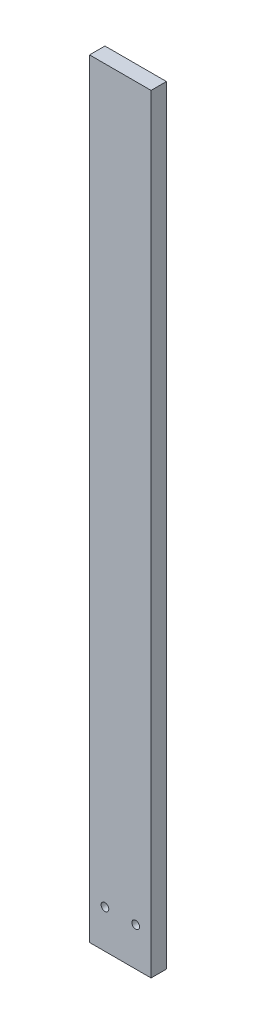
ISO-10303-21;
HEADER;
FILE_DESCRIPTION(('STEP AP214'),'2;1');
FILE_NAME('part.step','',(''),(''),'','','');
FILE_SCHEMA(('AUTOMOTIVE_DESIGN { 1 0 10303 214 1 1 1 1 }'));
ENDSEC;
DATA;
#1=APPLICATION_CONTEXT('core data for automotive mechanical design processes');
#2=APPLICATION_PROTOCOL_DEFINITION('international standard','automotive_design',2000,#1);
#3=PRODUCT_CONTEXT('',#1,'mechanical');
#4=PRODUCT('Part','Part','',(#3));
#5=PRODUCT_RELATED_PRODUCT_CATEGORY('part','',(#4));
#6=PRODUCT_DEFINITION_FORMATION('','',#4);
#7=PRODUCT_DEFINITION_CONTEXT('part definition',#1,'design');
#8=PRODUCT_DEFINITION('design','',#6,#7);
#9=PRODUCT_DEFINITION_SHAPE('','',#8);
#10=(LENGTH_UNIT() NAMED_UNIT(*) SI_UNIT(.MILLI.,.METRE.));
#11=(NAMED_UNIT(*) PLANE_ANGLE_UNIT() SI_UNIT($,.RADIAN.));
#12=(NAMED_UNIT(*) SI_UNIT($,.STERADIAN.) SOLID_ANGLE_UNIT());
#13=UNCERTAINTY_MEASURE_WITH_UNIT(LENGTH_MEASURE(1.E-05),#10,'distance_accuracy_value','');
#14=(GEOMETRIC_REPRESENTATION_CONTEXT(3) GLOBAL_UNCERTAINTY_ASSIGNED_CONTEXT((#13)) GLOBAL_UNIT_ASSIGNED_CONTEXT((#10,
#11,#12)) REPRESENTATION_CONTEXT('',''));
#15=CARTESIAN_POINT('',(0.,0.,0.));
#16=DIRECTION('',(0.,0.,1.));
#17=DIRECTION('',(1.,0.,0.));
#18=AXIS2_PLACEMENT_3D('',#15,#16,#17);
#19=CARTESIAN_POINT('',(20.,-250.,10.));
#20=DIRECTION('',(-1.,0.,0.));
#21=DIRECTION('',(0.,0.,1.));
#22=AXIS2_PLACEMENT_3D('',#19,#20,#21);
#23=PLANE('',#22);
#24=DIRECTION('',(0.,1.,0.));
#25=VECTOR('',#24,1.);
#26=CARTESIAN_POINT('',(20.,-250.,0.));
#27=LINE('',#26,#25);
#28=CARTESIAN_POINT('',(20.,-250.,0.));
#29=VERTEX_POINT('',#28);
#30=CARTESIAN_POINT('',(20.,250.,0.));
#31=VERTEX_POINT('',#30);
#32=EDGE_CURVE('E98',#29,#31,#27,.T.);
#33=ORIENTED_EDGE('',*,*,#32,.T.);
#34=DIRECTION('',(0.,0.,-1.));
#35=VECTOR('',#34,1.);
#36=CARTESIAN_POINT('',(20.,250.,10.));
#37=LINE('',#36,#35);
#38=CARTESIAN_POINT('',(20.,250.,10.));
#39=VERTEX_POINT('',#38);
#40=EDGE_CURVE('E11',#39,#31,#37,.T.);
#41=ORIENTED_EDGE('',*,*,#40,.F.);
#42=DIRECTION('',(0.,1.,0.));
#43=VECTOR('',#42,1.);
#44=CARTESIAN_POINT('',(20.,-250.,10.));
#45=LINE('',#44,#43);
#46=CARTESIAN_POINT('',(20.,-250.,10.));
#47=VERTEX_POINT('',#46);
#48=EDGE_CURVE('E86',#47,#39,#45,.T.);
#49=ORIENTED_EDGE('',*,*,#48,.F.);
#50=DIRECTION('',(0.,0.,-1.));
#51=VECTOR('',#50,1.);
#52=CARTESIAN_POINT('',(20.,-250.,10.));
#53=LINE('',#52,#51);
#54=EDGE_CURVE('E94',#47,#29,#53,.T.);
#55=ORIENTED_EDGE('',*,*,#54,.T.);
#56=EDGE_LOOP('',(#33,#41,#49,#55));
#57=FACE_BOUND('',#56,.T.);
#58=ADVANCED_FACE('F35',(#57),#23,.F.);
#59=CARTESIAN_POINT('',(-20.,250.,10.));
#60=DIRECTION('',(0.,-1.,0.));
#61=DIRECTION('',(0.,0.,-1.));
#62=AXIS2_PLACEMENT_3D('',#59,#60,#61);
#63=PLANE('',#62);
#64=DIRECTION('',(-1.,0.,0.));
#65=VECTOR('',#64,1.);
#66=CARTESIAN_POINT('',(-20.,250.,0.));
#67=LINE('',#66,#65);
#68=CARTESIAN_POINT('',(-20.,250.,0.));
#69=VERTEX_POINT('',#68);
#70=EDGE_CURVE('E90',#31,#69,#67,.T.);
#71=ORIENTED_EDGE('',*,*,#70,.T.);
#72=DIRECTION('',(0.,0.,-1.));
#73=VECTOR('',#72,1.);
#74=CARTESIAN_POINT('',(-20.,250.,10.));
#75=LINE('',#74,#73);
#76=CARTESIAN_POINT('',(-20.,250.,10.));
#77=VERTEX_POINT('',#76);
#78=EDGE_CURVE('E43',#77,#69,#75,.T.);
#79=ORIENTED_EDGE('',*,*,#78,.F.);
#80=DIRECTION('',(-1.,0.,0.));
#81=VECTOR('',#80,1.);
#82=CARTESIAN_POINT('',(-20.,250.,10.));
#83=LINE('',#82,#81);
#84=EDGE_CURVE('E81',#39,#77,#83,.T.);
#85=ORIENTED_EDGE('',*,*,#84,.F.);
#86=ORIENTED_EDGE('',*,*,#40,.T.);
#87=EDGE_LOOP('',(#71,#79,#85,#86));
#88=FACE_BOUND('',#87,.T.);
#89=ADVANCED_FACE('F89',(#88),#63,.F.);
#90=CARTESIAN_POINT('',(-20.,-250.,10.));
#91=DIRECTION('',(1.,0.,0.));
#92=DIRECTION('',(0.,0.,-1.));
#93=AXIS2_PLACEMENT_3D('',#90,#91,#92);
#94=PLANE('',#93);
#95=DIRECTION('',(0.,-1.,0.));
#96=VECTOR('',#95,1.);
#97=CARTESIAN_POINT('',(-20.,-250.,0.));
#98=LINE('',#97,#96);
#99=CARTESIAN_POINT('',(-20.,-250.,0.));
#100=VERTEX_POINT('',#99);
#101=EDGE_CURVE('E68',#69,#100,#98,.T.);
#102=ORIENTED_EDGE('',*,*,#101,.T.);
#103=DIRECTION('',(0.,0.,-1.));
#104=VECTOR('',#103,1.);
#105=CARTESIAN_POINT('',(-20.,-250.,10.));
#106=LINE('',#105,#104);
#107=CARTESIAN_POINT('',(-20.,-250.,10.));
#108=VERTEX_POINT('',#107);
#109=EDGE_CURVE('E91',#108,#100,#106,.T.);
#110=ORIENTED_EDGE('',*,*,#109,.F.);
#111=DIRECTION('',(0.,-1.,0.));
#112=VECTOR('',#111,1.);
#113=CARTESIAN_POINT('',(-20.,-250.,10.));
#114=LINE('',#113,#112);
#115=EDGE_CURVE('E84',#77,#108,#114,.T.);
#116=ORIENTED_EDGE('',*,*,#115,.F.);
#117=ORIENTED_EDGE('',*,*,#78,.T.);
#118=EDGE_LOOP('',(#102,#110,#116,#117));
#119=FACE_BOUND('',#118,.T.);
#120=ADVANCED_FACE('F92',(#119),#94,.F.);
#121=CARTESIAN_POINT('',(-20.,-250.,10.));
#122=DIRECTION('',(0.,1.,0.));
#123=DIRECTION('',(0.,0.,1.));
#124=AXIS2_PLACEMENT_3D('',#121,#122,#123);
#125=PLANE('',#124);
#126=DIRECTION('',(1.,0.,0.));
#127=VECTOR('',#126,1.);
#128=CARTESIAN_POINT('',(-20.,-250.,0.));
#129=LINE('',#128,#127);
#130=EDGE_CURVE('E74',#100,#29,#129,.T.);
#131=ORIENTED_EDGE('',*,*,#130,.T.);
#132=ORIENTED_EDGE('',*,*,#54,.F.);
#133=DIRECTION('',(1.,0.,0.));
#134=VECTOR('',#133,1.);
#135=CARTESIAN_POINT('',(-20.,-250.,10.));
#136=LINE('',#135,#134);
#137=EDGE_CURVE('E51',#108,#47,#136,.T.);
#138=ORIENTED_EDGE('',*,*,#137,.F.);
#139=ORIENTED_EDGE('',*,*,#109,.T.);
#140=EDGE_LOOP('',(#131,#132,#138,#139));
#141=FACE_BOUND('',#140,.T.);
#142=ADVANCED_FACE('F106',(#141),#125,.F.);
#143=CARTESIAN_POINT('',(0.,0.,10.));
#144=DIRECTION('',(0.,0.,-1.));
#145=DIRECTION('',(-1.,0.,0.));
#146=AXIS2_PLACEMENT_3D('',#143,#144,#145);
#147=PLANE('',#146);
#148=CARTESIAN_POINT('',(9.99999999999997,-225.,10.));
#149=DIRECTION('',(0.,0.,-1.));
#150=DIRECTION('',(1.,0.,0.));
#151=AXIS2_PLACEMENT_3D('',#148,#149,#150);
#152=CIRCLE('',#151,2.5);
#153=CARTESIAN_POINT('',(12.5,-225.,10.));
#154=VERTEX_POINT('',#153);
#155=EDGE_CURVE('E115',#154,#154,#152,.T.);
#156=ORIENTED_EDGE('',*,*,#155,.T.);
#157=EDGE_LOOP('',(#156));
#158=FACE_BOUND('',#157,.T.);
#159=CARTESIAN_POINT('',(-10.,-225.,10.));
#160=DIRECTION('',(0.,0.,-1.));
#161=DIRECTION('',(-1.,0.,0.));
#162=AXIS2_PLACEMENT_3D('',#159,#160,#161);
#163=CIRCLE('',#162,2.5);
#164=CARTESIAN_POINT('',(-12.5,-225.,10.));
#165=VERTEX_POINT('',#164);
#166=EDGE_CURVE('E101',#165,#165,#163,.T.);
#167=ORIENTED_EDGE('',*,*,#166,.T.);
#168=EDGE_LOOP('',(#167));
#169=FACE_BOUND('',#168,.T.);
#170=ORIENTED_EDGE('',*,*,#48,.T.);
#171=ORIENTED_EDGE('',*,*,#84,.T.);
#172=ORIENTED_EDGE('',*,*,#115,.T.);
#173=ORIENTED_EDGE('',*,*,#137,.T.);
#174=EDGE_LOOP('',(#170,#171,#172,#173));
#175=FACE_BOUND('',#174,.T.);
#176=ADVANCED_FACE('F82',(#158,#169,#175),#147,.F.);
#177=CARTESIAN_POINT('',(0.,0.,0.));
#178=DIRECTION('',(0.,0.,-1.));
#179=DIRECTION('',(-1.,0.,0.));
#180=AXIS2_PLACEMENT_3D('',#177,#178,#179);
#181=PLANE('',#180);
#182=CARTESIAN_POINT('',(9.99999999999997,-225.,0.));
#183=DIRECTION('',(0.,0.,-1.));
#184=DIRECTION('',(1.,0.,0.));
#185=AXIS2_PLACEMENT_3D('',#182,#183,#184);
#186=CIRCLE('',#185,2.5);
#187=CARTESIAN_POINT('',(12.5,-225.,0.));
#188=VERTEX_POINT('',#187);
#189=EDGE_CURVE('E118',#188,#188,#186,.T.);
#190=ORIENTED_EDGE('',*,*,#189,.F.);
#191=EDGE_LOOP('',(#190));
#192=FACE_BOUND('',#191,.T.);
#193=CARTESIAN_POINT('',(-10.,-225.,0.));
#194=DIRECTION('',(0.,0.,-1.));
#195=DIRECTION('',(-1.,0.,0.));
#196=AXIS2_PLACEMENT_3D('',#193,#194,#195);
#197=CIRCLE('',#196,2.5);
#198=CARTESIAN_POINT('',(-12.5,-225.,0.));
#199=VERTEX_POINT('',#198);
#200=EDGE_CURVE('E112',#199,#199,#197,.T.);
#201=ORIENTED_EDGE('',*,*,#200,.F.);
#202=EDGE_LOOP('',(#201));
#203=FACE_BOUND('',#202,.T.);
#204=ORIENTED_EDGE('',*,*,#32,.F.);
#205=ORIENTED_EDGE('',*,*,#130,.F.);
#206=ORIENTED_EDGE('',*,*,#101,.F.);
#207=ORIENTED_EDGE('',*,*,#70,.F.);
#208=EDGE_LOOP('',(#204,#205,#206,#207));
#209=FACE_BOUND('',#208,.T.);
#210=ADVANCED_FACE('F109',(#192,#203,#209),#181,.T.);
#211=CARTESIAN_POINT('',(-10.,-225.,10.));
#212=DIRECTION('',(0.,0.,-1.));
#213=DIRECTION('',(-1.,0.,0.));
#214=AXIS2_PLACEMENT_3D('',#211,#212,#213);
#215=CYLINDRICAL_SURFACE('',#214,2.5);
#216=ORIENTED_EDGE('',*,*,#166,.F.);
#217=EDGE_LOOP('',(#216));
#218=FACE_BOUND('',#217,.T.);
#219=ORIENTED_EDGE('',*,*,#200,.T.);
#220=EDGE_LOOP('',(#219));
#221=FACE_BOUND('',#220,.T.);
#222=ADVANCED_FACE('F129',(#218,#221),#215,.F.);
#223=CARTESIAN_POINT('',(9.99999999999997,-225.,10.));
#224=DIRECTION('',(0.,0.,-1.));
#225=DIRECTION('',(-1.,0.,0.));
#226=AXIS2_PLACEMENT_3D('',#223,#224,#225);
#227=CYLINDRICAL_SURFACE('',#226,2.5);
#228=ORIENTED_EDGE('',*,*,#155,.F.);
#229=EDGE_LOOP('',(#228));
#230=FACE_BOUND('',#229,.T.);
#231=ORIENTED_EDGE('',*,*,#189,.T.);
#232=EDGE_LOOP('',(#231));
#233=FACE_BOUND('',#232,.T.);
#234=ADVANCED_FACE('F126',(#230,#233),#227,.F.);
#235=CLOSED_SHELL('',(#58,#89,#120,#142,#176,#210,#222,#234));
#236=MANIFOLD_SOLID_BREP('B2',#235);
#237=ADVANCED_BREP_SHAPE_REPRESENTATION('',(#18,#236),#14);
#238=SHAPE_DEFINITION_REPRESENTATION(#9,#237);
ENDSEC;
END-ISO-10303-21;
